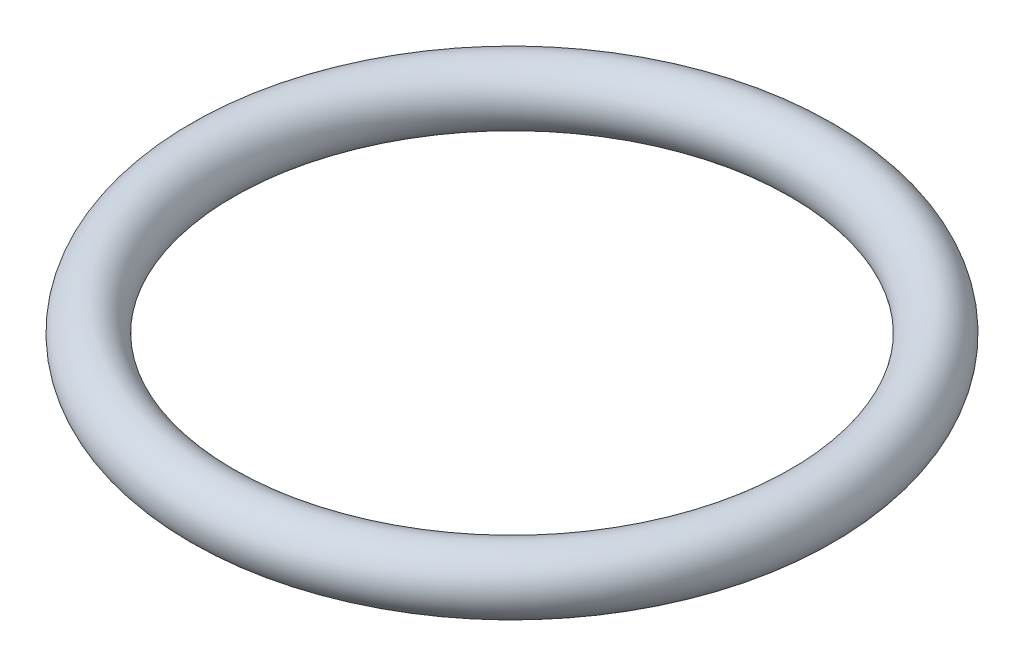
ISO-10303-21;
HEADER;
FILE_DESCRIPTION(('STEP AP214'),'2;1');
FILE_NAME('part.step','',(''),(''),'','','');
FILE_SCHEMA(('AUTOMOTIVE_DESIGN { 1 0 10303 214 1 1 1 1 }'));
ENDSEC;
DATA;
#1=APPLICATION_CONTEXT('core data for automotive mechanical design processes');
#2=APPLICATION_PROTOCOL_DEFINITION('international standard','automotive_design',2000,#1);
#3=PRODUCT_CONTEXT('',#1,'mechanical');
#4=PRODUCT('Part','Part','',(#3));
#5=PRODUCT_RELATED_PRODUCT_CATEGORY('part','',(#4));
#6=PRODUCT_DEFINITION_FORMATION('','',#4);
#7=PRODUCT_DEFINITION_CONTEXT('part definition',#1,'design');
#8=PRODUCT_DEFINITION('design','',#6,#7);
#9=PRODUCT_DEFINITION_SHAPE('','',#8);
#10=(LENGTH_UNIT() NAMED_UNIT(*) SI_UNIT(.MILLI.,.METRE.));
#11=(NAMED_UNIT(*) PLANE_ANGLE_UNIT() SI_UNIT($,.RADIAN.));
#12=(NAMED_UNIT(*) SI_UNIT($,.STERADIAN.) SOLID_ANGLE_UNIT());
#13=UNCERTAINTY_MEASURE_WITH_UNIT(LENGTH_MEASURE(1.E-05),#10,'distance_accuracy_value','');
#14=(GEOMETRIC_REPRESENTATION_CONTEXT(3) GLOBAL_UNCERTAINTY_ASSIGNED_CONTEXT((#13)) GLOBAL_UNIT_ASSIGNED_CONTEXT((#10,
#11,#12)) REPRESENTATION_CONTEXT('',''));
#15=CARTESIAN_POINT('',(0.,0.,0.));
#16=DIRECTION('',(0.,0.,1.));
#17=DIRECTION('',(1.,0.,0.));
#18=AXIS2_PLACEMENT_3D('',#15,#16,#17);
#19=CARTESIAN_POINT('',(0.,0.,0.));
#20=DIRECTION('',(0.,-1.,0.));
#21=DIRECTION('',(0.,0.,-1.));
#22=AXIS2_PLACEMENT_3D('',#19,#20,#21);
#23=TOROIDAL_SURFACE('',#22,12.7,1.27);
#24=CARTESIAN_POINT('',(0.,0.,-13.97));
#25=VERTEX_POINT('',#24);
#26=VERTEX_LOOP('',#25);
#27=FACE_BOUND('',#26,.T.);
#28=ADVANCED_FACE('F34',(#27),#23,.T.);
#29=CLOSED_SHELL('',(#28));
#30=MANIFOLD_SOLID_BREP('B2',#29);
#31=ADVANCED_BREP_SHAPE_REPRESENTATION('',(#18,#30),#14);
#32=SHAPE_DEFINITION_REPRESENTATION(#9,#31);
ENDSEC;
END-ISO-10303-21;
